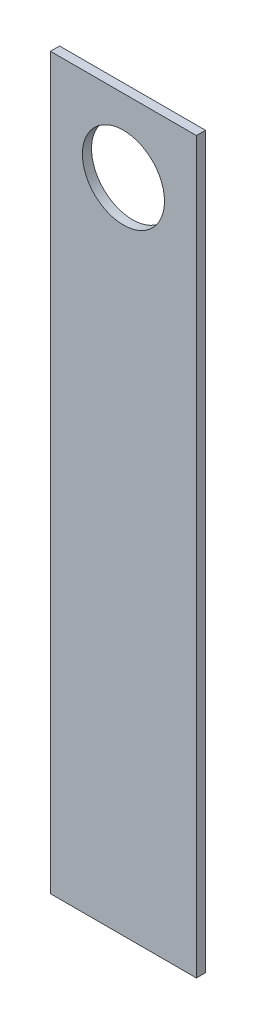
ISO-10303-21;
HEADER;
FILE_DESCRIPTION(('STEP AP214'),'2;1');
FILE_NAME('part.step','',(''),(''),'','','');
FILE_SCHEMA(('AUTOMOTIVE_DESIGN { 1 0 10303 214 1 1 1 1 }'));
ENDSEC;
DATA;
#1=APPLICATION_CONTEXT('core data for automotive mechanical design processes');
#2=APPLICATION_PROTOCOL_DEFINITION('international standard','automotive_design',2000,#1);
#3=PRODUCT_CONTEXT('',#1,'mechanical');
#4=PRODUCT('Part','Part','',(#3));
#5=PRODUCT_RELATED_PRODUCT_CATEGORY('part','',(#4));
#6=PRODUCT_DEFINITION_FORMATION('','',#4);
#7=PRODUCT_DEFINITION_CONTEXT('part definition',#1,'design');
#8=PRODUCT_DEFINITION('design','',#6,#7);
#9=PRODUCT_DEFINITION_SHAPE('','',#8);
#10=(LENGTH_UNIT() NAMED_UNIT(*) SI_UNIT(.MILLI.,.METRE.));
#11=(NAMED_UNIT(*) PLANE_ANGLE_UNIT() SI_UNIT($,.RADIAN.));
#12=(NAMED_UNIT(*) SI_UNIT($,.STERADIAN.) SOLID_ANGLE_UNIT());
#13=UNCERTAINTY_MEASURE_WITH_UNIT(LENGTH_MEASURE(1.E-05),#10,'distance_accuracy_value','');
#14=(GEOMETRIC_REPRESENTATION_CONTEXT(3) GLOBAL_UNCERTAINTY_ASSIGNED_CONTEXT((#13)) GLOBAL_UNIT_ASSIGNED_CONTEXT((#10,
#11,#12)) REPRESENTATION_CONTEXT('',''));
#15=CARTESIAN_POINT('',(0.,0.,0.));
#16=DIRECTION('',(0.,0.,1.));
#17=DIRECTION('',(1.,0.,0.));
#18=AXIS2_PLACEMENT_3D('',#15,#16,#17);
#19=CARTESIAN_POINT('',(0.,0.,3.175));
#20=DIRECTION('',(0.,0.,-1.));
#21=DIRECTION('',(-1.,0.,0.));
#22=AXIS2_PLACEMENT_3D('',#19,#20,#21);
#23=PLANE('',#22);
#24=DIRECTION('',(0.,-1.,0.));
#25=VECTOR('',#24,1.);
#26=CARTESIAN_POINT('',(0.,0.,3.175));
#27=LINE('',#26,#25);
#28=CARTESIAN_POINT('',(0.,254.,3.175));
#29=VERTEX_POINT('',#28);
#30=CARTESIAN_POINT('',(0.,0.,3.175));
#31=VERTEX_POINT('',#30);
#32=EDGE_CURVE('E85',#29,#31,#27,.T.);
#33=ORIENTED_EDGE('',*,*,#32,.T.);
#34=DIRECTION('',(1.,0.,0.));
#35=VECTOR('',#34,1.);
#36=CARTESIAN_POINT('',(0.,0.,3.175));
#37=LINE('',#36,#35);
#38=CARTESIAN_POINT('',(50.8,0.,3.175));
#39=VERTEX_POINT('',#38);
#40=EDGE_CURVE('E80',#31,#39,#37,.T.);
#41=ORIENTED_EDGE('',*,*,#40,.T.);
#42=DIRECTION('',(0.,1.,0.));
#43=VECTOR('',#42,1.);
#44=CARTESIAN_POINT('',(50.8,0.,3.175));
#45=LINE('',#44,#43);
#46=CARTESIAN_POINT('',(50.8,254.,3.175));
#47=VERTEX_POINT('',#46);
#48=EDGE_CURVE('E83',#39,#47,#45,.T.);
#49=ORIENTED_EDGE('',*,*,#48,.T.);
#50=DIRECTION('',(-1.,0.,0.));
#51=VECTOR('',#50,1.);
#52=CARTESIAN_POINT('',(0.,254.,3.175));
#53=LINE('',#52,#51);
#54=EDGE_CURVE('E50',#47,#29,#53,.T.);
#55=ORIENTED_EDGE('',*,*,#54,.T.);
#56=EDGE_LOOP('',(#33,#41,#49,#55));
#57=FACE_BOUND('',#56,.T.);
#58=CARTESIAN_POINT('',(25.4,228.6,3.175));
#59=DIRECTION('',(0.,0.,1.));
#60=DIRECTION('',(1.,0.,0.));
#61=AXIS2_PLACEMENT_3D('',#58,#59,#60);
#62=CIRCLE('',#61,14.2875);
#63=CARTESIAN_POINT('',(39.6875,228.6,3.175));
#64=VERTEX_POINT('',#63);
#65=EDGE_CURVE('E100',#64,#64,#62,.T.);
#66=ORIENTED_EDGE('',*,*,#65,.F.);
#67=EDGE_LOOP('',(#66));
#68=FACE_BOUND('',#67,.T.);
#69=ADVANCED_FACE('F33',(#57,#68),#23,.F.);
#70=CARTESIAN_POINT('',(0.,0.,0.));
#71=DIRECTION('',(0.,0.,-1.));
#72=DIRECTION('',(-1.,0.,0.));
#73=AXIS2_PLACEMENT_3D('',#70,#71,#72);
#74=PLANE('',#73);
#75=DIRECTION('',(0.,-1.,0.));
#76=VECTOR('',#75,1.);
#77=CARTESIAN_POINT('',(0.,0.,0.));
#78=LINE('',#77,#76);
#79=CARTESIAN_POINT('',(0.,254.,0.));
#80=VERTEX_POINT('',#79);
#81=CARTESIAN_POINT('',(0.,0.,0.));
#82=VERTEX_POINT('',#81);
#83=EDGE_CURVE('E97',#80,#82,#78,.T.);
#84=ORIENTED_EDGE('',*,*,#83,.F.);
#85=DIRECTION('',(-1.,0.,0.));
#86=VECTOR('',#85,1.);
#87=CARTESIAN_POINT('',(0.,254.,0.));
#88=LINE('',#87,#86);
#89=CARTESIAN_POINT('',(50.8,254.,0.));
#90=VERTEX_POINT('',#89);
#91=EDGE_CURVE('E73',#90,#80,#88,.T.);
#92=ORIENTED_EDGE('',*,*,#91,.F.);
#93=DIRECTION('',(0.,1.,0.));
#94=VECTOR('',#93,1.);
#95=CARTESIAN_POINT('',(50.8,0.,0.));
#96=LINE('',#95,#94);
#97=CARTESIAN_POINT('',(50.8,0.,0.));
#98=VERTEX_POINT('',#97);
#99=EDGE_CURVE('E67',#98,#90,#96,.T.);
#100=ORIENTED_EDGE('',*,*,#99,.F.);
#101=DIRECTION('',(1.,0.,0.));
#102=VECTOR('',#101,1.);
#103=CARTESIAN_POINT('',(0.,0.,0.));
#104=LINE('',#103,#102);
#105=EDGE_CURVE('E89',#82,#98,#104,.T.);
#106=ORIENTED_EDGE('',*,*,#105,.F.);
#107=EDGE_LOOP('',(#84,#92,#100,#106));
#108=FACE_BOUND('',#107,.T.);
#109=CARTESIAN_POINT('',(25.4,228.6,0.));
#110=DIRECTION('',(0.,0.,1.));
#111=DIRECTION('',(1.,0.,0.));
#112=AXIS2_PLACEMENT_3D('',#109,#110,#111);
#113=CIRCLE('',#112,14.2875);
#114=CARTESIAN_POINT('',(39.6875,228.6,0.));
#115=VERTEX_POINT('',#114);
#116=EDGE_CURVE('E112',#115,#115,#113,.T.);
#117=ORIENTED_EDGE('',*,*,#116,.T.);
#118=EDGE_LOOP('',(#117));
#119=FACE_BOUND('',#118,.T.);
#120=ADVANCED_FACE('F108',(#108,#119),#74,.T.);
#121=CARTESIAN_POINT('',(0.,0.,3.175));
#122=DIRECTION('',(1.,0.,0.));
#123=DIRECTION('',(0.,0.,-1.));
#124=AXIS2_PLACEMENT_3D('',#121,#122,#123);
#125=PLANE('',#124);
#126=ORIENTED_EDGE('',*,*,#83,.T.);
#127=DIRECTION('',(0.,0.,-1.));
#128=VECTOR('',#127,1.);
#129=CARTESIAN_POINT('',(0.,0.,3.175));
#130=LINE('',#129,#128);
#131=EDGE_CURVE('E11',#31,#82,#130,.T.);
#132=ORIENTED_EDGE('',*,*,#131,.F.);
#133=ORIENTED_EDGE('',*,*,#32,.F.);
#134=DIRECTION('',(0.,0.,-1.));
#135=VECTOR('',#134,1.);
#136=CARTESIAN_POINT('',(0.,254.,3.175));
#137=LINE('',#136,#135);
#138=EDGE_CURVE('E93',#29,#80,#137,.T.);
#139=ORIENTED_EDGE('',*,*,#138,.T.);
#140=EDGE_LOOP('',(#126,#132,#133,#139));
#141=FACE_BOUND('',#140,.T.);
#142=ADVANCED_FACE('F35',(#141),#125,.F.);
#143=CARTESIAN_POINT('',(0.,0.,3.175));
#144=DIRECTION('',(0.,1.,0.));
#145=DIRECTION('',(0.,0.,1.));
#146=AXIS2_PLACEMENT_3D('',#143,#144,#145);
#147=PLANE('',#146);
#148=ORIENTED_EDGE('',*,*,#105,.T.);
#149=DIRECTION('',(0.,0.,-1.));
#150=VECTOR('',#149,1.);
#151=CARTESIAN_POINT('',(50.8,0.,3.175));
#152=LINE('',#151,#150);
#153=EDGE_CURVE('E42',#39,#98,#152,.T.);
#154=ORIENTED_EDGE('',*,*,#153,.F.);
#155=ORIENTED_EDGE('',*,*,#40,.F.);
#156=ORIENTED_EDGE('',*,*,#131,.T.);
#157=EDGE_LOOP('',(#148,#154,#155,#156));
#158=FACE_BOUND('',#157,.T.);
#159=ADVANCED_FACE('F88',(#158),#147,.F.);
#160=CARTESIAN_POINT('',(50.8,0.,3.175));
#161=DIRECTION('',(-1.,0.,0.));
#162=DIRECTION('',(0.,0.,1.));
#163=AXIS2_PLACEMENT_3D('',#160,#161,#162);
#164=PLANE('',#163);
#165=ORIENTED_EDGE('',*,*,#99,.T.);
#166=DIRECTION('',(0.,0.,-1.));
#167=VECTOR('',#166,1.);
#168=CARTESIAN_POINT('',(50.8,254.,3.175));
#169=LINE('',#168,#167);
#170=EDGE_CURVE('E90',#47,#90,#169,.T.);
#171=ORIENTED_EDGE('',*,*,#170,.F.);
#172=ORIENTED_EDGE('',*,*,#48,.F.);
#173=ORIENTED_EDGE('',*,*,#153,.T.);
#174=EDGE_LOOP('',(#165,#171,#172,#173));
#175=FACE_BOUND('',#174,.T.);
#176=ADVANCED_FACE('F91',(#175),#164,.F.);
#177=CARTESIAN_POINT('',(0.,254.,3.175));
#178=DIRECTION('',(0.,-1.,0.));
#179=DIRECTION('',(0.,0.,-1.));
#180=AXIS2_PLACEMENT_3D('',#177,#178,#179);
#181=PLANE('',#180);
#182=ORIENTED_EDGE('',*,*,#91,.T.);
#183=ORIENTED_EDGE('',*,*,#138,.F.);
#184=ORIENTED_EDGE('',*,*,#54,.F.);
#185=ORIENTED_EDGE('',*,*,#170,.T.);
#186=EDGE_LOOP('',(#182,#183,#184,#185));
#187=FACE_BOUND('',#186,.T.);
#188=ADVANCED_FACE('F105',(#187),#181,.F.);
#189=CARTESIAN_POINT('',(25.4,228.6,3.175));
#190=DIRECTION('',(0.,0.,-1.));
#191=DIRECTION('',(-1.,0.,0.));
#192=AXIS2_PLACEMENT_3D('',#189,#190,#191);
#193=CYLINDRICAL_SURFACE('',#192,14.2875);
#194=ORIENTED_EDGE('',*,*,#65,.T.);
#195=EDGE_LOOP('',(#194));
#196=FACE_BOUND('',#195,.T.);
#197=ORIENTED_EDGE('',*,*,#116,.F.);
#198=EDGE_LOOP('',(#197));
#199=FACE_BOUND('',#198,.T.);
#200=ADVANCED_FACE('F118',(#196,#199),#193,.F.);
#201=CLOSED_SHELL('',(#69,#120,#142,#159,#176,#188,#200));
#202=MANIFOLD_SOLID_BREP('B2',#201);
#203=ADVANCED_BREP_SHAPE_REPRESENTATION('',(#18,#202),#14);
#204=SHAPE_DEFINITION_REPRESENTATION(#9,#203);
ENDSEC;
END-ISO-10303-21;
